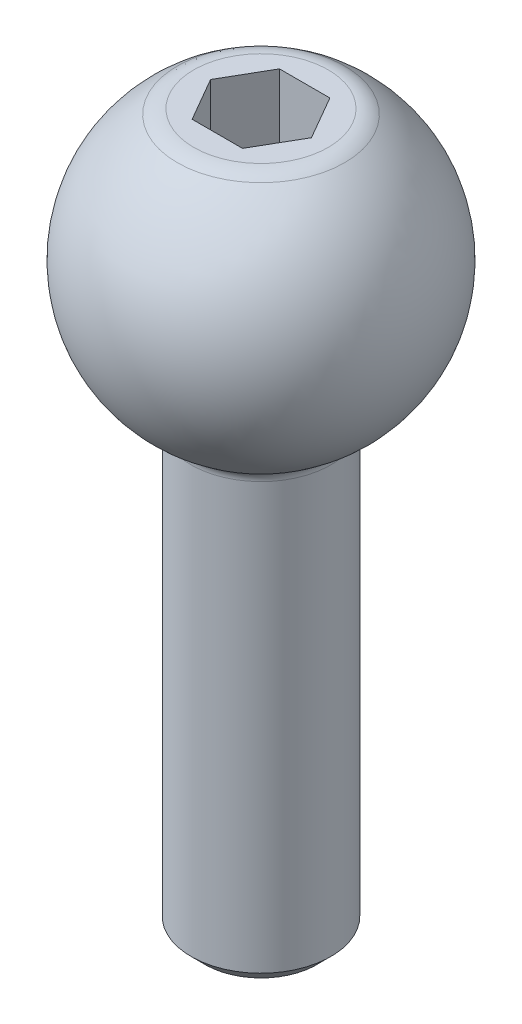
ISO-10303-21;
HEADER;
FILE_DESCRIPTION(('STEP AP214'),'2;1');
FILE_NAME('part.step','',(''),(''),'','','');
FILE_SCHEMA(('AUTOMOTIVE_DESIGN { 1 0 10303 214 1 1 1 1 }'));
ENDSEC;
DATA;
#1=APPLICATION_CONTEXT('core data for automotive mechanical design processes');
#2=APPLICATION_PROTOCOL_DEFINITION('international standard','automotive_design',2000,#1);
#3=PRODUCT_CONTEXT('',#1,'mechanical');
#4=PRODUCT('Part','Part','',(#3));
#5=PRODUCT_RELATED_PRODUCT_CATEGORY('part','',(#4));
#6=PRODUCT_DEFINITION_FORMATION('','',#4);
#7=PRODUCT_DEFINITION_CONTEXT('part definition',#1,'design');
#8=PRODUCT_DEFINITION('design','',#6,#7);
#9=PRODUCT_DEFINITION_SHAPE('','',#8);
#10=(LENGTH_UNIT() NAMED_UNIT(*) SI_UNIT(.MILLI.,.METRE.));
#11=(NAMED_UNIT(*) PLANE_ANGLE_UNIT() SI_UNIT($,.RADIAN.));
#12=(NAMED_UNIT(*) SI_UNIT($,.STERADIAN.) SOLID_ANGLE_UNIT());
#13=UNCERTAINTY_MEASURE_WITH_UNIT(LENGTH_MEASURE(1.E-05),#10,'distance_accuracy_value','');
#14=(GEOMETRIC_REPRESENTATION_CONTEXT(3) GLOBAL_UNCERTAINTY_ASSIGNED_CONTEXT((#13)) GLOBAL_UNIT_ASSIGNED_CONTEXT((#10,
#11,#12)) REPRESENTATION_CONTEXT('',''));
#15=CARTESIAN_POINT('',(0.,0.,0.));
#16=DIRECTION('',(0.,0.,1.));
#17=DIRECTION('',(1.,0.,0.));
#18=AXIS2_PLACEMENT_3D('',#15,#16,#17);
#19=CARTESIAN_POINT('',(0.,3.57451985412027,0.));
#20=DIRECTION('',(0.,1.,0.));
#21=DIRECTION('',(0.,0.,1.));
#22=AXIS2_PLACEMENT_3D('',#19,#20,#21);
#23=PLANE('',#22);
#24=DIRECTION('',(-0.5,0.,-0.866025403784438));
#25=VECTOR('',#24,1.);
#26=CARTESIAN_POINT('',(1.3748153285078,3.57451985412027,0.));
#27=LINE('',#26,#25);
#28=CARTESIAN_POINT('',(1.3748153285078,3.57451985412027,0.));
#29=VERTEX_POINT('',#28);
#30=CARTESIAN_POINT('',(0.6874076642539,3.57451985412027,-1.190625));
#31=VERTEX_POINT('',#30);
#32=EDGE_CURVE('E49',#29,#31,#27,.T.);
#33=ORIENTED_EDGE('',*,*,#32,.F.);
#34=DIRECTION('',(0.499999999999999,0.,-0.866025403784439));
#35=VECTOR('',#34,1.);
#36=CARTESIAN_POINT('',(0.687407664253899,3.57451985412027,1.190625));
#37=LINE('',#36,#35);
#38=CARTESIAN_POINT('',(0.687407664253899,3.57451985412027,1.190625));
#39=VERTEX_POINT('',#38);
#40=EDGE_CURVE('E132',#39,#29,#37,.T.);
#41=ORIENTED_EDGE('',*,*,#40,.F.);
#42=DIRECTION('',(1.,0.,0.));
#43=VECTOR('',#42,1.);
#44=CARTESIAN_POINT('',(-0.687407664253893,3.57451985412027,1.19062500000001));
#45=LINE('',#44,#43);
#46=CARTESIAN_POINT('',(-0.687407664253893,3.57451985412027,1.19062500000001));
#47=VERTEX_POINT('',#46);
#48=EDGE_CURVE('E130',#47,#39,#45,.T.);
#49=ORIENTED_EDGE('',*,*,#48,.F.);
#50=DIRECTION('',(0.5,0.,0.866025403784439));
#51=VECTOR('',#50,1.);
#52=CARTESIAN_POINT('',(-1.37481532850779,3.57451985412027,0.));
#53=LINE('',#52,#51);
#54=CARTESIAN_POINT('',(-1.37481532850779,3.57451985412027,0.));
#55=VERTEX_POINT('',#54);
#56=EDGE_CURVE('E97',#55,#47,#53,.T.);
#57=ORIENTED_EDGE('',*,*,#56,.F.);
#58=DIRECTION('',(-0.499999999999999,0.,0.866025403784439));
#59=VECTOR('',#58,1.);
#60=CARTESIAN_POINT('',(-0.687407664253897,3.57451985412027,-1.190625));
#61=LINE('',#60,#59);
#62=CARTESIAN_POINT('',(-0.687407664253897,3.57451985412027,-1.190625));
#63=VERTEX_POINT('',#62);
#64=EDGE_CURVE('E126',#63,#55,#61,.T.);
#65=ORIENTED_EDGE('',*,*,#64,.F.);
#66=DIRECTION('',(-1.,0.,0.));
#67=VECTOR('',#66,1.);
#68=CARTESIAN_POINT('',(0.6874076642539,3.57451985412027,-1.190625));
#69=LINE('',#68,#67);
#70=EDGE_CURVE('E123',#31,#63,#69,.T.);
#71=ORIENTED_EDGE('',*,*,#70,.F.);
#72=EDGE_LOOP('',(#33,#41,#49,#57,#65,#71));
#73=FACE_BOUND('',#72,.T.);
#74=CARTESIAN_POINT('',(0.,3.57451985412027,0.));
#75=DIRECTION('',(0.,1.,0.));
#76=DIRECTION('',(0.,0.,1.));
#77=AXIS2_PLACEMENT_3D('',#74,#75,#76);
#78=CIRCLE('',#77,1.83306833952199);
#79=CARTESIAN_POINT('',(0.,3.57451985412027,1.83306833952199));
#80=VERTEX_POINT('',#79);
#81=EDGE_CURVE('E42',#80,#80,#78,.T.);
#82=ORIENTED_EDGE('',*,*,#81,.T.);
#83=EDGE_LOOP('',(#82));
#84=FACE_BOUND('',#83,.T.);
#85=ADVANCED_FACE('F34',(#73,#84),#23,.T.);
#86=CARTESIAN_POINT('',(0.,0.,0.));
#87=DIRECTION('',(0.,-1.,0.));
#88=DIRECTION('',(1.,0.,0.));
#89=AXIS2_PLACEMENT_3D('',#86,#87,#88);
#90=SPHERICAL_SURFACE('',#89,4.1275);
#91=CARTESIAN_POINT('',(0.,3.4389231899965,0.));
#92=DIRECTION('',(0.,-1.,0.));
#93=DIRECTION('',(0.,0.,-1.));
#94=AXIS2_PLACEMENT_3D('',#91,#92,#93);
#95=CIRCLE('',#94,2.28255636147375);
#96=CARTESIAN_POINT('',(2.28255636147374,3.43892318999651,0.));
#97=VERTEX_POINT('',#96);
#98=EDGE_CURVE('E11',#97,#97,#95,.T.);
#99=CARTESIAN_POINT('',(0.,-3.55757974853397,0.));
#100=DIRECTION('',(0.,1.,0.));
#101=DIRECTION('',(-1.,0.,0.));
#102=AXIS2_PLACEMENT_3D('',#99,#100,#101);
#103=CIRCLE('',#102,2.09281690140848);
#104=CARTESIAN_POINT('',(2.09281690140849,-3.55757974853396,0.));
#105=VERTEX_POINT('',#104);
#106=EDGE_CURVE('E147',#105,#105,#103,.T.);
#107=CARTESIAN_POINT('',(2.28255636147374,3.43892318999651,0.));
#108=CARTESIAN_POINT('',(2.35505798357408,3.39080558247677,0.));
#109=CARTESIAN_POINT('',(2.4260332394035,3.34038911810698,0.));
#110=CARTESIAN_POINT('',(2.56465769851458,3.23517389673687,0.));
#111=CARTESIAN_POINT('',(2.63230690179625,3.18037513973656,0.));
#112=CARTESIAN_POINT('',(2.7640059358059,3.06661075417502,0.));
#113=CARTESIAN_POINT('',(2.82805576653389,3.00764512561378,0.));
#114=CARTESIAN_POINT('',(2.95230069197059,2.88578377551208,0.));
#115=CARTESIAN_POINT('',(3.01249578667929,2.82288805397161,0.));
#116=CARTESIAN_POINT('',(3.12879033568442,2.6934177536557,0.));
#117=CARTESIAN_POINT('',(3.18488978998085,2.62684317488026,0.));
#118=CARTESIAN_POINT('',(3.29276878690031,2.49028144362942,0.));
#119=CARTESIAN_POINT('',(3.34454832952335,2.42029429115403,0.));
#120=CARTESIAN_POINT('',(3.4435804373418,2.27718725159394,0.));
#121=CARTESIAN_POINT('',(3.49083300253721,2.20406736450925,0.));
#122=CARTESIAN_POINT('',(3.58062221017666,2.05498724591568,0.));
#123=CARTESIAN_POINT('',(3.62315885262069,1.97902701440679,0.));
#124=CARTESIAN_POINT('',(3.70334612210895,1.82456994837222,0.));
#125=CARTESIAN_POINT('',(3.74099674915318,1.74607311384654,0.));
#126=CARTESIAN_POINT('',(3.8112614342607,1.58685672805805,0.));
#127=CARTESIAN_POINT('',(3.84387549232398,1.50613717679524,0.));
#128=CARTESIAN_POINT('',(3.90393662530327,1.34279813134153,0.));
#129=CARTESIAN_POINT('',(3.93138370021926,1.26017863715063,0.));
#130=CARTESIAN_POINT('',(3.98100111408863,1.09337007709132,0.));
#131=CARTESIAN_POINT('',(4.00317145304201,1.00918101122291,0.));
#132=CARTESIAN_POINT('',(4.04214674227123,0.839569955284417,0.));
#133=CARTESIAN_POINT('',(4.05895169254708,0.754147965214333,0.));
#134=CARTESIAN_POINT('',(4.08712900633523,0.582412638461022,0.));
#135=CARTESIAN_POINT('',(4.09850136984754,0.496099301777794,0.));
#136=CARTESIAN_POINT('',(4.1157680353484,0.322926423619074,0.));
#137=CARTESIAN_POINT('',(4.12166233733695,0.236066882143581,0.));
#138=CARTESIAN_POINT('',(4.12794931019846,0.0621489203352679,0.));
#139=CARTESIAN_POINT('',(4.12834198107142,-0.0249094999975531,0.));
#140=CARTESIAN_POINT('',(4.1236241215256,-0.198877098327288,0.));
#141=CARTESIAN_POINT('',(4.11851359110681,-0.285786276324202,0.));
#142=CARTESIAN_POINT('',(4.1028097644959,-0.459107865565398,0.));
#143=CARTESIAN_POINT('',(4.09221646830376,-0.545520276809679,0.));
#144=CARTESIAN_POINT('',(4.06558946964324,-0.717502794553855,0.));
#145=CARTESIAN_POINT('',(4.04955576717485,-0.80307290105375,0.));
#146=CARTESIAN_POINT('',(4.01211207005491,-0.973028639448702,0.));
#147=CARTESIAN_POINT('',(3.99070207540337,-1.05741427134376,0.));
#148=CARTESIAN_POINT('',(3.94259140623057,-1.22466362703405,0.));
#149=CARTESIAN_POINT('',(3.91589073170932,-1.30752735082928,0.));
#150=CARTESIAN_POINT('',(3.85730547100026,-1.4714015425002,0.));
#151=CARTESIAN_POINT('',(3.82542088481245,-1.55241201037588,0.));
#152=CARTESIAN_POINT('',(3.75659529789844,-1.7122557529823,0.));
#153=CARTESIAN_POINT('',(3.71965429717225,-1.79108902771303,0.));
#154=CARTESIAN_POINT('',(3.64086359752219,-1.94626315289331,0.));
#155=CARTESIAN_POINT('',(3.59901389859833,-2.02260400334284,0.));
#156=CARTESIAN_POINT('',(3.51057314701629,-2.17248801481704,0.));
#157=CARTESIAN_POINT('',(3.46398209435812,-2.24603117584169,0.));
#158=CARTESIAN_POINT('',(3.36624494028224,-2.39002573227193,0.));
#159=CARTESIAN_POINT('',(3.31509883886453,-2.46047712767751,0.));
#160=CARTESIAN_POINT('',(3.20845610199031,-2.59800643300038,0.));
#161=CARTESIAN_POINT('',(3.15295946653379,-2.66508434291768,0.));
#162=CARTESIAN_POINT('',(3.0378375898488,-2.79559847214168,0.));
#163=CARTESIAN_POINT('',(2.97821234862032,-2.8590346914484,0.));
#164=CARTESIAN_POINT('',(2.85507163418518,-2.98201170247323,0.));
#165=CARTESIAN_POINT('',(2.79155616097852,-3.04155249419135,0.));
#166=CARTESIAN_POINT('',(2.66088914949716,-3.15650084022517,0.));
#167=CARTESIAN_POINT('',(2.59373761122246,-3.21190839454087,0.));
#168=CARTESIAN_POINT('',(2.45606629077887,-3.31836767552938,0.));
#169=CARTESIAN_POINT('',(2.38554650860998,-3.36941940220218,0.));
#170=CARTESIAN_POINT('',(2.24142329415394,-3.46696673700257,0.));
#171=CARTESIAN_POINT('',(2.16781986186679,-3.51346234513015,0.));
#172=CARTESIAN_POINT('',(2.09281690140849,-3.55757974853396,0.));
#173=B_SPLINE_CURVE_WITH_KNOTS('',3,(#107,#108,#109,#110,#111,#112,#113,#114,#115,#116,#117,
#118,#119,#120,#121,#122,#123,#124,#125,#126,#127,#128,#129,#130,#131,#132,#133,#134,#135,#136,
#137,#138,#139,#140,#141,#142,#143,#144,#145,#146,#147,#148,#149,#150,#151,#152,#153,#154,#155,
#156,#157,#158,#159,#160,#161,#162,#163,#164,#165,#166,#167,#168,#169,#170,#171,#172),
.UNSPECIFIED.,.F.,.F.,(4,2,2,2,2,2,2,2,2,2,2,2,2,2,2,2,2,2,2,2,2,2,2,2,2,2,2,2,2,2,2,2,4),(0.,
0.261003855289272,0.522007710578545,0.783011565867818,1.04401542115709,1.30501927644636,
1.56602313173564,1.82702698702491,2.08803084231418,2.34903469760345,2.61003855289272,
2.871042408182,3.13204626347127,3.39305011876054,3.65405397404982,3.91505782933909,
4.17606168462836,4.43706553991763,4.69806939520691,4.95907325049618,5.22007710578545,
5.48108096107472,5.742084816364,6.00308867165327,6.26409252694254,6.52509638223181,
6.78610023752108,7.04710409281036,7.30810794809963,7.5691118033889,7.83011565867818,
8.09111951396745,8.35212336925672),.UNSPECIFIED.);
#174=EDGE_CURVE('BSEAM171',#97,#105,#173,.T.);
#175=ORIENTED_EDGE('',*,*,#98,.T.);
#176=ORIENTED_EDGE('',*,*,#106,.T.);
#177=ORIENTED_EDGE('',*,*,#174,.T.);
#178=ORIENTED_EDGE('',*,*,#174,.F.);
#179=EDGE_LOOP('',(#175,#177,#176,#178));
#180=FACE_BOUND('',#179,.T.);
#181=ADVANCED_FACE('F171',(#180),#90,.T.);
#182=CARTESIAN_POINT('',(2.26469490810481E-12,-648.63440136707,0.));
#183=DIRECTION('',(0.,-1.,0.));
#184=DIRECTION('',(1.,0.,0.));
#185=AXIS2_PLACEMENT_3D('',#182,#183,#184);
#186=CYLINDRICAL_SURFACE('',#185,1.90500000000003);
#187=CARTESIAN_POINT('',(0.,-15.494,0.));
#188=DIRECTION('',(0.,1.,0.));
#189=DIRECTION('',(-1.,0.,0.));
#190=AXIS2_PLACEMENT_3D('',#187,#188,#189);
#191=CIRCLE('',#190,1.90500000000003);
#192=CARTESIAN_POINT('',(-1.90499999999998,-15.494,0.));
#193=VERTEX_POINT('',#192);
#194=EDGE_CURVE('E136',#193,#193,#191,.T.);
#195=ORIENTED_EDGE('',*,*,#194,.T.);
#196=EDGE_LOOP('',(#195));
#197=FACE_BOUND('',#196,.T.);
#198=CARTESIAN_POINT('',(0.,-3.88597172532168,0.));
#199=DIRECTION('',(0.,1.,0.));
#200=DIRECTION('',(-1.,0.,0.));
#201=AXIS2_PLACEMENT_3D('',#198,#199,#200);
#202=CIRCLE('',#201,1.90500000000003);
#203=CARTESIAN_POINT('',(-1.90500000000002,-3.88597172532169,0.));
#204=VERTEX_POINT('',#203);
#205=EDGE_CURVE('E150',#204,#204,#202,.F.);
#206=ORIENTED_EDGE('',*,*,#205,.T.);
#207=EDGE_LOOP('',(#206));
#208=FACE_BOUND('',#207,.T.);
#209=ADVANCED_FACE('F175',(#197,#208),#186,.T.);
#210=CARTESIAN_POINT('',(0.,-15.875,0.));
#211=DIRECTION('',(0.,1.,0.));
#212=DIRECTION('',(-1.,0.,0.));
#213=AXIS2_PLACEMENT_3D('',#210,#211,#212);
#214=PLANE('',#213);
#215=CARTESIAN_POINT('',(0.,-15.875,0.));
#216=DIRECTION('',(0.,1.,0.));
#217=DIRECTION('',(-1.,0.,0.));
#218=AXIS2_PLACEMENT_3D('',#215,#216,#217);
#219=CIRCLE('',#218,1.52400000000001);
#220=CARTESIAN_POINT('',(-1.52399999999995,-15.875,0.));
#221=VERTEX_POINT('',#220);
#222=EDGE_CURVE('E144',#221,#221,#219,.F.);
#223=ORIENTED_EDGE('',*,*,#222,.T.);
#224=EDGE_LOOP('',(#223));
#225=FACE_BOUND('',#224,.T.);
#226=ADVANCED_FACE('F180',(#225),#214,.F.);
#227=CARTESIAN_POINT('',(0.,-3.88597172532172,0.));
#228=DIRECTION('',(0.,1.,0.));
#229=DIRECTION('',(-1.,0.,0.));
#230=AXIS2_PLACEMENT_3D('',#227,#228,#229);
#231=TOROIDAL_SURFACE('',#230,2.28600000000003,0.381);
#232=ORIENTED_EDGE('',*,*,#106,.F.);
#233=EDGE_LOOP('',(#232));
#234=FACE_BOUND('',#233,.T.);
#235=ORIENTED_EDGE('',*,*,#205,.F.);
#236=EDGE_LOOP('',(#235));
#237=FACE_BOUND('',#236,.T.);
#238=ADVANCED_FACE('F166',(#234,#237),#231,.F.);
#239=CARTESIAN_POINT('',(0.,-15.875,0.));
#240=DIRECTION('',(0.,1.,0.));
#241=DIRECTION('',(-1.,0.,0.));
#242=AXIS2_PLACEMENT_3D('',#239,#240,#241);
#243=CONICAL_SURFACE('',#242,1.52400000000003,0.785398163397494);
#244=ORIENTED_EDGE('',*,*,#194,.F.);
#245=EDGE_LOOP('',(#244));
#246=FACE_BOUND('',#245,.T.);
#247=ORIENTED_EDGE('',*,*,#222,.F.);
#248=EDGE_LOOP('',(#247));
#249=FACE_BOUND('',#248,.T.);
#250=ADVANCED_FACE('F158',(#246,#249),#243,.T.);
#251=CARTESIAN_POINT('',(0.,2.76171985412027,0.));
#252=DIRECTION('',(0.,1.,0.));
#253=DIRECTION('',(0.,0.,1.));
#254=AXIS2_PLACEMENT_3D('',#251,#252,#253);
#255=TOROIDAL_SURFACE('',#254,1.83306833952199,0.8128);
#256=ORIENTED_EDGE('',*,*,#98,.F.);
#257=EDGE_LOOP('',(#256));
#258=FACE_BOUND('',#257,.T.);
#259=ORIENTED_EDGE('',*,*,#81,.F.);
#260=EDGE_LOOP('',(#259));
#261=FACE_BOUND('',#260,.T.);
#262=ADVANCED_FACE('F36',(#258,#261),#255,.T.);
#263=CARTESIAN_POINT('',(1.3748153285078,1.03451985412027,0.));
#264=DIRECTION('',(0.866025403784438,0.,-0.5));
#265=DIRECTION('',(-0.5,0.,-0.866025403784438));
#266=AXIS2_PLACEMENT_3D('',#263,#264,#265);
#267=PLANE('',#266);
#268=ORIENTED_EDGE('',*,*,#32,.T.);
#269=DIRECTION('',(0.,1.,0.));
#270=VECTOR('',#269,1.);
#271=CARTESIAN_POINT('',(0.6874076642539,1.03451985412027,-1.190625));
#272=LINE('',#271,#270);
#273=CARTESIAN_POINT('',(0.6874076642539,1.03451985412027,-1.190625));
#274=VERTEX_POINT('',#273);
#275=EDGE_CURVE('E79',#274,#31,#272,.T.);
#276=ORIENTED_EDGE('',*,*,#275,.F.);
#277=DIRECTION('',(-0.5,0.,-0.866025403784438));
#278=VECTOR('',#277,1.);
#279=CARTESIAN_POINT('',(1.3748153285078,1.03451985412027,0.));
#280=LINE('',#279,#278);
#281=CARTESIAN_POINT('',(1.3748153285078,1.03451985412027,0.));
#282=VERTEX_POINT('',#281);
#283=EDGE_CURVE('E134',#282,#274,#280,.T.);
#284=ORIENTED_EDGE('',*,*,#283,.F.);
#285=DIRECTION('',(0.,1.,0.));
#286=VECTOR('',#285,1.);
#287=CARTESIAN_POINT('',(1.3748153285078,1.03451985412027,0.));
#288=LINE('',#287,#286);
#289=EDGE_CURVE('E57',#282,#29,#288,.T.);
#290=ORIENTED_EDGE('',*,*,#289,.T.);
#291=EDGE_LOOP('',(#268,#276,#284,#290));
#292=FACE_BOUND('',#291,.T.);
#293=ADVANCED_FACE('F157',(#292),#267,.F.);
#294=CARTESIAN_POINT('',(0.687407664253899,1.03451985412027,1.190625));
#295=DIRECTION('',(0.866025403784439,0.,0.499999999999999));
#296=DIRECTION('',(0.499999999999999,0.,-0.866025403784439));
#297=AXIS2_PLACEMENT_3D('',#294,#295,#296);
#298=PLANE('',#297);
#299=ORIENTED_EDGE('',*,*,#40,.T.);
#300=ORIENTED_EDGE('',*,*,#289,.F.);
#301=DIRECTION('',(0.499999999999999,0.,-0.866025403784439));
#302=VECTOR('',#301,1.);
#303=CARTESIAN_POINT('',(0.687407664253899,1.03451985412027,1.190625));
#304=LINE('',#303,#302);
#305=CARTESIAN_POINT('',(0.687407664253899,1.03451985412027,1.190625));
#306=VERTEX_POINT('',#305);
#307=EDGE_CURVE('E109',#306,#282,#304,.T.);
#308=ORIENTED_EDGE('',*,*,#307,.F.);
#309=DIRECTION('',(0.,1.,0.));
#310=VECTOR('',#309,1.);
#311=CARTESIAN_POINT('',(0.687407664253899,1.03451985412027,1.190625));
#312=LINE('',#311,#310);
#313=EDGE_CURVE('E101',#306,#39,#312,.T.);
#314=ORIENTED_EDGE('',*,*,#313,.T.);
#315=EDGE_LOOP('',(#299,#300,#308,#314));
#316=FACE_BOUND('',#315,.T.);
#317=ADVANCED_FACE('F164',(#316),#298,.F.);
#318=CARTESIAN_POINT('',(-0.687407664253893,1.03451985412027,1.19062500000001));
#319=DIRECTION('',(0.,0.,1.));
#320=DIRECTION('',(1.,0.,0.));
#321=AXIS2_PLACEMENT_3D('',#318,#319,#320);
#322=PLANE('',#321);
#323=ORIENTED_EDGE('',*,*,#48,.T.);
#324=ORIENTED_EDGE('',*,*,#313,.F.);
#325=DIRECTION('',(1.,0.,0.));
#326=VECTOR('',#325,1.);
#327=CARTESIAN_POINT('',(-0.687407664253893,1.03451985412027,1.19062500000001));
#328=LINE('',#327,#326);
#329=CARTESIAN_POINT('',(-0.687407664253893,1.03451985412027,1.19062500000001));
#330=VERTEX_POINT('',#329);
#331=EDGE_CURVE('E105',#330,#306,#328,.T.);
#332=ORIENTED_EDGE('',*,*,#331,.F.);
#333=DIRECTION('',(0.,1.,0.));
#334=VECTOR('',#333,1.);
#335=CARTESIAN_POINT('',(-0.687407664253893,1.03451985412027,1.19062500000001));
#336=LINE('',#335,#334);
#337=EDGE_CURVE('E90',#330,#47,#336,.T.);
#338=ORIENTED_EDGE('',*,*,#337,.T.);
#339=EDGE_LOOP('',(#323,#324,#332,#338));
#340=FACE_BOUND('',#339,.T.);
#341=ADVANCED_FACE('F106',(#340),#322,.F.);
#342=CARTESIAN_POINT('',(-1.37481532850779,1.03451985412027,0.));
#343=DIRECTION('',(-0.866025403784439,0.,0.5));
#344=DIRECTION('',(0.5,0.,0.866025403784439));
#345=AXIS2_PLACEMENT_3D('',#342,#343,#344);
#346=PLANE('',#345);
#347=ORIENTED_EDGE('',*,*,#56,.T.);
#348=ORIENTED_EDGE('',*,*,#337,.F.);
#349=DIRECTION('',(0.5,0.,0.866025403784439));
#350=VECTOR('',#349,1.);
#351=CARTESIAN_POINT('',(-1.37481532850779,1.03451985412027,0.));
#352=LINE('',#351,#350);
#353=CARTESIAN_POINT('',(-1.37481532850779,1.03451985412027,0.));
#354=VERTEX_POINT('',#353);
#355=EDGE_CURVE('E94',#354,#330,#352,.T.);
#356=ORIENTED_EDGE('',*,*,#355,.F.);
#357=DIRECTION('',(0.,1.,0.));
#358=VECTOR('',#357,1.);
#359=CARTESIAN_POINT('',(-1.37481532850779,1.03451985412027,0.));
#360=LINE('',#359,#358);
#361=EDGE_CURVE('E102',#354,#55,#360,.T.);
#362=ORIENTED_EDGE('',*,*,#361,.T.);
#363=EDGE_LOOP('',(#347,#348,#356,#362));
#364=FACE_BOUND('',#363,.T.);
#365=ADVANCED_FACE('F92',(#364),#346,.F.);
#366=CARTESIAN_POINT('',(-0.687407664253897,1.03451985412027,-1.190625));
#367=DIRECTION('',(-0.866025403784439,0.,-0.499999999999999));
#368=DIRECTION('',(-0.499999999999999,0.,0.866025403784439));
#369=AXIS2_PLACEMENT_3D('',#366,#367,#368);
#370=PLANE('',#369);
#371=ORIENTED_EDGE('',*,*,#64,.T.);
#372=ORIENTED_EDGE('',*,*,#361,.F.);
#373=DIRECTION('',(-0.499999999999999,0.,0.866025403784439));
#374=VECTOR('',#373,1.);
#375=CARTESIAN_POINT('',(-0.687407664253897,1.03451985412027,-1.190625));
#376=LINE('',#375,#374);
#377=CARTESIAN_POINT('',(-0.687407664253897,1.03451985412027,-1.190625));
#378=VERTEX_POINT('',#377);
#379=EDGE_CURVE('E115',#378,#354,#376,.T.);
#380=ORIENTED_EDGE('',*,*,#379,.F.);
#381=DIRECTION('',(0.,1.,0.));
#382=VECTOR('',#381,1.);
#383=CARTESIAN_POINT('',(-0.687407664253897,1.03451985412027,-1.190625));
#384=LINE('',#383,#382);
#385=EDGE_CURVE('E139',#378,#63,#384,.T.);
#386=ORIENTED_EDGE('',*,*,#385,.T.);
#387=EDGE_LOOP('',(#371,#372,#380,#386));
#388=FACE_BOUND('',#387,.T.);
#389=ADVANCED_FACE('F194',(#388),#370,.F.);
#390=CARTESIAN_POINT('',(0.6874076642539,1.03451985412027,-1.190625));
#391=DIRECTION('',(0.,0.,-1.));
#392=DIRECTION('',(-1.,0.,0.));
#393=AXIS2_PLACEMENT_3D('',#390,#391,#392);
#394=PLANE('',#393);
#395=ORIENTED_EDGE('',*,*,#70,.T.);
#396=ORIENTED_EDGE('',*,*,#385,.F.);
#397=DIRECTION('',(-1.,0.,0.));
#398=VECTOR('',#397,1.);
#399=CARTESIAN_POINT('',(0.6874076642539,1.03451985412027,-1.190625));
#400=LINE('',#399,#398);
#401=EDGE_CURVE('E117',#274,#378,#400,.T.);
#402=ORIENTED_EDGE('',*,*,#401,.F.);
#403=ORIENTED_EDGE('',*,*,#275,.T.);
#404=EDGE_LOOP('',(#395,#396,#402,#403));
#405=FACE_BOUND('',#404,.T.);
#406=ADVANCED_FACE('F191',(#405),#394,.F.);
#407=CARTESIAN_POINT('',(0.,1.03451985412027,0.));
#408=DIRECTION('',(0.,1.,0.));
#409=DIRECTION('',(0.,0.,1.));
#410=AXIS2_PLACEMENT_3D('',#407,#408,#409);
#411=PLANE('',#410);
#412=ORIENTED_EDGE('',*,*,#283,.T.);
#413=ORIENTED_EDGE('',*,*,#401,.T.);
#414=ORIENTED_EDGE('',*,*,#379,.T.);
#415=ORIENTED_EDGE('',*,*,#355,.T.);
#416=ORIENTED_EDGE('',*,*,#331,.T.);
#417=ORIENTED_EDGE('',*,*,#307,.T.);
#418=EDGE_LOOP('',(#412,#413,#414,#415,#416,#417));
#419=FACE_BOUND('',#418,.T.);
#420=ADVANCED_FACE('F112',(#419),#411,.T.);
#421=CLOSED_SHELL('',(#85,#181,#209,#226,#238,#250,#262,#293,#317,#341,#365,#389,#406,#420));
#422=MANIFOLD_SOLID_BREP('B2',#421);
#423=ADVANCED_BREP_SHAPE_REPRESENTATION('',(#18,#422),#14);
#424=SHAPE_DEFINITION_REPRESENTATION(#9,#423);
ENDSEC;
END-ISO-10303-21;
